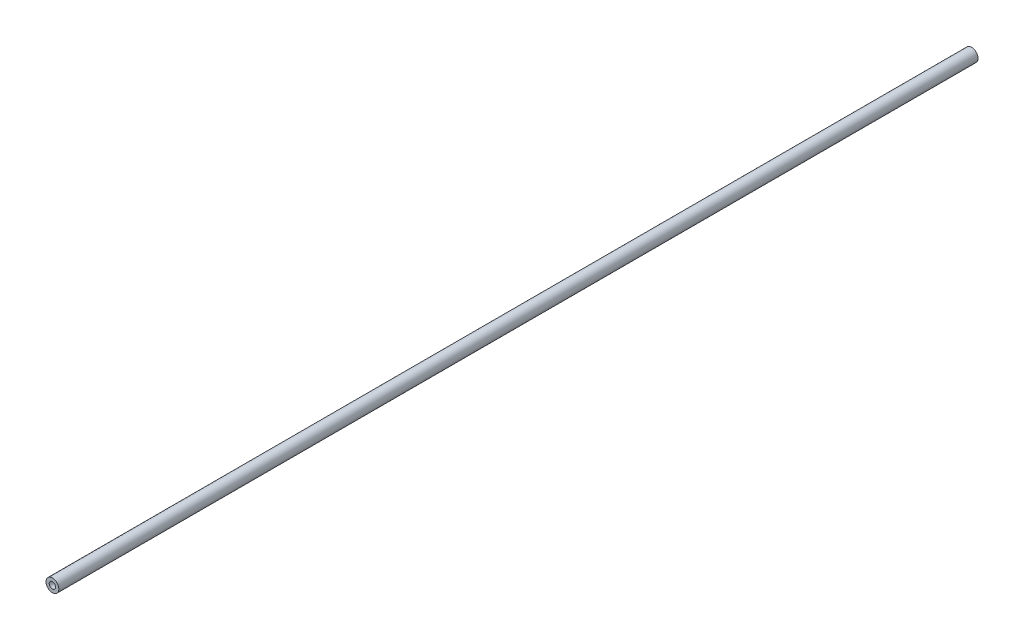
ISO-10303-21;
HEADER;
FILE_DESCRIPTION(('STEP AP214'),'2;1');
FILE_NAME('part.step','',(''),(''),'','','');
FILE_SCHEMA(('AUTOMOTIVE_DESIGN { 1 0 10303 214 1 1 1 1 }'));
ENDSEC;
DATA;
#1=APPLICATION_CONTEXT('core data for automotive mechanical design processes');
#2=APPLICATION_PROTOCOL_DEFINITION('international standard','automotive_design',2000,#1);
#3=PRODUCT_CONTEXT('',#1,'mechanical');
#4=PRODUCT('Part','Part','',(#3));
#5=PRODUCT_RELATED_PRODUCT_CATEGORY('part','',(#4));
#6=PRODUCT_DEFINITION_FORMATION('','',#4);
#7=PRODUCT_DEFINITION_CONTEXT('part definition',#1,'design');
#8=PRODUCT_DEFINITION('design','',#6,#7);
#9=PRODUCT_DEFINITION_SHAPE('','',#8);
#10=(LENGTH_UNIT() NAMED_UNIT(*) SI_UNIT(.MILLI.,.METRE.));
#11=(NAMED_UNIT(*) PLANE_ANGLE_UNIT() SI_UNIT($,.RADIAN.));
#12=(NAMED_UNIT(*) SI_UNIT($,.STERADIAN.) SOLID_ANGLE_UNIT());
#13=UNCERTAINTY_MEASURE_WITH_UNIT(LENGTH_MEASURE(1.E-05),#10,'distance_accuracy_value','');
#14=(GEOMETRIC_REPRESENTATION_CONTEXT(3) GLOBAL_UNCERTAINTY_ASSIGNED_CONTEXT((#13)) GLOBAL_UNIT_ASSIGNED_CONTEXT((#10,
#11,#12)) REPRESENTATION_CONTEXT('',''));
#15=CARTESIAN_POINT('',(0.,0.,0.));
#16=DIRECTION('',(0.,0.,1.));
#17=DIRECTION('',(1.,0.,0.));
#18=AXIS2_PLACEMENT_3D('',#15,#16,#17);
#19=CARTESIAN_POINT('',(0.,0.,0.));
#20=DIRECTION('',(0.,0.,1.));
#21=DIRECTION('',(1.,0.,0.));
#22=AXIS2_PLACEMENT_3D('',#19,#20,#21);
#23=CYLINDRICAL_SURFACE('',#22,1.5);
#24=CARTESIAN_POINT('',(0.,0.,0.));
#25=DIRECTION('',(0.,0.,-1.));
#26=DIRECTION('',(1.,0.,0.));
#27=AXIS2_PLACEMENT_3D('',#24,#25,#26);
#28=CIRCLE('',#27,1.5);
#29=CARTESIAN_POINT('',(-1.5,0.,0.));
#30=VERTEX_POINT('',#29);
#31=EDGE_CURVE('E55',#30,#30,#28,.T.);
#32=ORIENTED_EDGE('',*,*,#31,.T.);
#33=DIRECTION('',(0.,0.,1.));
#34=VECTOR('',#33,1.);
#35=CARTESIAN_POINT('',(-1.5,0.,0.));
#36=LINE('',#35,#34);
#37=CARTESIAN_POINT('',(-1.5,0.,430.));
#38=VERTEX_POINT('',#37);
#39=EDGE_CURVE('E11',#30,#38,#36,.T.);
#40=ORIENTED_EDGE('',*,*,#39,.T.);
#41=CARTESIAN_POINT('',(0.,0.,430.));
#42=DIRECTION('',(0.,0.,-1.));
#43=DIRECTION('',(1.,0.,0.));
#44=AXIS2_PLACEMENT_3D('',#41,#42,#43);
#45=CIRCLE('',#44,1.5);
#46=EDGE_CURVE('E27',#38,#38,#45,.T.);
#47=ORIENTED_EDGE('',*,*,#46,.F.);
#48=ORIENTED_EDGE('',*,*,#39,.F.);
#49=EDGE_LOOP('',(#32,#40,#47,#48));
#50=FACE_BOUND('',#49,.T.);
#51=ADVANCED_FACE('F17',(#50),#23,.F.);
#52=CARTESIAN_POINT('',(0.,0.,430.));
#53=DIRECTION('',(0.,0.,1.));
#54=DIRECTION('',(1.,0.,0.));
#55=AXIS2_PLACEMENT_3D('',#52,#53,#54);
#56=PLANE('',#55);
#57=ORIENTED_EDGE('',*,*,#46,.T.);
#58=EDGE_LOOP('',(#57));
#59=FACE_BOUND('',#58,.T.);
#60=CARTESIAN_POINT('',(0.,0.,430.));
#61=DIRECTION('',(0.,0.,1.));
#62=DIRECTION('',(1.,0.,0.));
#63=AXIS2_PLACEMENT_3D('',#60,#61,#62);
#64=CIRCLE('',#63,3.);
#65=CARTESIAN_POINT('',(-3.,0.,430.));
#66=VERTEX_POINT('',#65);
#67=EDGE_CURVE('E62',#66,#66,#64,.T.);
#68=ORIENTED_EDGE('',*,*,#67,.T.);
#69=EDGE_LOOP('',(#68));
#70=FACE_BOUND('',#69,.T.);
#71=ADVANCED_FACE('F85',(#59,#70),#56,.T.);
#72=CARTESIAN_POINT('',(0.,0.,0.));
#73=DIRECTION('',(0.,0.,1.));
#74=DIRECTION('',(1.,0.,0.));
#75=AXIS2_PLACEMENT_3D('',#72,#73,#74);
#76=CYLINDRICAL_SURFACE('',#75,3.);
#77=ORIENTED_EDGE('',*,*,#67,.F.);
#78=DIRECTION('',(0.,0.,-1.));
#79=VECTOR('',#78,1.);
#80=CARTESIAN_POINT('',(-3.,0.,0.));
#81=LINE('',#80,#79);
#82=CARTESIAN_POINT('',(-3.,0.,0.));
#83=VERTEX_POINT('',#82);
#84=EDGE_CURVE('E51',#66,#83,#81,.T.);
#85=ORIENTED_EDGE('',*,*,#84,.T.);
#86=CARTESIAN_POINT('',(0.,0.,0.));
#87=DIRECTION('',(0.,0.,1.));
#88=DIRECTION('',(1.,0.,0.));
#89=AXIS2_PLACEMENT_3D('',#86,#87,#88);
#90=CIRCLE('',#89,3.);
#91=EDGE_CURVE('E20',#83,#83,#90,.T.);
#92=ORIENTED_EDGE('',*,*,#91,.T.);
#93=ORIENTED_EDGE('',*,*,#84,.F.);
#94=EDGE_LOOP('',(#77,#85,#92,#93));
#95=FACE_BOUND('',#94,.T.);
#96=ADVANCED_FACE('F75',(#95),#76,.T.);
#97=CARTESIAN_POINT('',(0.,0.,0.));
#98=DIRECTION('',(0.,0.,1.));
#99=DIRECTION('',(1.,0.,0.));
#100=AXIS2_PLACEMENT_3D('',#97,#98,#99);
#101=PLANE('',#100);
#102=ORIENTED_EDGE('',*,*,#31,.F.);
#103=EDGE_LOOP('',(#102));
#104=FACE_BOUND('',#103,.T.);
#105=ORIENTED_EDGE('',*,*,#91,.F.);
#106=EDGE_LOOP('',(#105));
#107=FACE_BOUND('',#106,.T.);
#108=ADVANCED_FACE('F77',(#104,#107),#101,.F.);
#109=CLOSED_SHELL('',(#51,#71,#96,#108));
#110=MANIFOLD_SOLID_BREP('B1',#109);
#111=ADVANCED_BREP_SHAPE_REPRESENTATION('',(#18,#110),#14);
#112=SHAPE_DEFINITION_REPRESENTATION(#9,#111);
ENDSEC;
END-ISO-10303-21;
